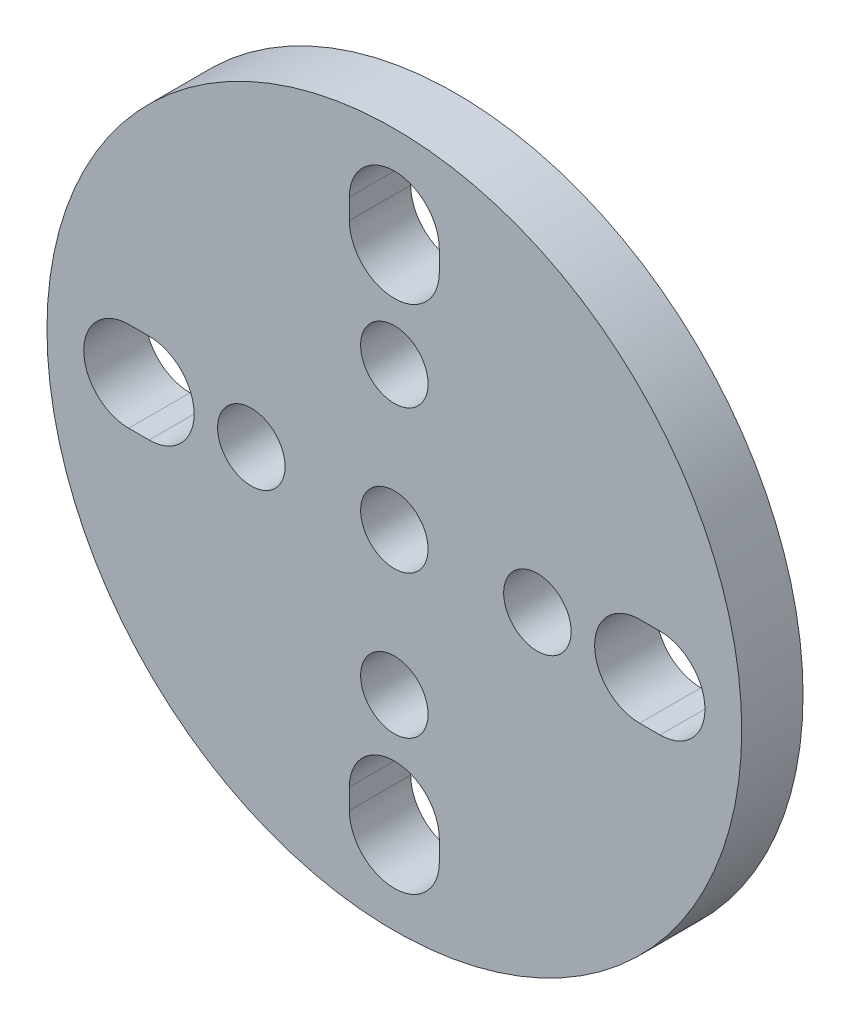
ISO-10303-21;
HEADER;
FILE_DESCRIPTION(('STEP AP214'),'2;1');
FILE_NAME('part.step','',(''),(''),'','','');
FILE_SCHEMA(('AUTOMOTIVE_DESIGN { 1 0 10303 214 1 1 1 1 }'));
ENDSEC;
DATA;
#1=APPLICATION_CONTEXT('core data for automotive mechanical design processes');
#2=APPLICATION_PROTOCOL_DEFINITION('international standard','automotive_design',2000,#1);
#3=PRODUCT_CONTEXT('',#1,'mechanical');
#4=PRODUCT('Part','Part','',(#3));
#5=PRODUCT_RELATED_PRODUCT_CATEGORY('part','',(#4));
#6=PRODUCT_DEFINITION_FORMATION('','',#4);
#7=PRODUCT_DEFINITION_CONTEXT('part definition',#1,'design');
#8=PRODUCT_DEFINITION('design','',#6,#7);
#9=PRODUCT_DEFINITION_SHAPE('','',#8);
#10=(LENGTH_UNIT() NAMED_UNIT(*) SI_UNIT(.MILLI.,.METRE.));
#11=(NAMED_UNIT(*) PLANE_ANGLE_UNIT() SI_UNIT($,.RADIAN.));
#12=(NAMED_UNIT(*) SI_UNIT($,.STERADIAN.) SOLID_ANGLE_UNIT());
#13=UNCERTAINTY_MEASURE_WITH_UNIT(LENGTH_MEASURE(1.E-05),#10,'distance_accuracy_value','');
#14=(GEOMETRIC_REPRESENTATION_CONTEXT(3) GLOBAL_UNCERTAINTY_ASSIGNED_CONTEXT((#13)) GLOBAL_UNIT_ASSIGNED_CONTEXT((#10,
#11,#12)) REPRESENTATION_CONTEXT('',''));
#15=CARTESIAN_POINT('',(0.,0.,0.));
#16=DIRECTION('',(0.,0.,1.));
#17=DIRECTION('',(1.,0.,0.));
#18=AXIS2_PLACEMENT_3D('',#15,#16,#17);
#19=CARTESIAN_POINT('',(0.,12.,3.));
#20=DIRECTION('',(0.,0.,-1.));
#21=DIRECTION('',(-1.,0.,0.));
#22=AXIS2_PLACEMENT_3D('',#19,#20,#21);
#23=CYLINDRICAL_SURFACE('',#22,2.2);
#24=CARTESIAN_POINT('',(0.,12.,0.));
#25=DIRECTION('',(0.,0.,1.));
#26=DIRECTION('',(1.,0.,0.));
#27=AXIS2_PLACEMENT_3D('',#24,#25,#26);
#28=CIRCLE('',#27,2.2);
#29=CARTESIAN_POINT('',(-2.2,12.,0.));
#30=VERTEX_POINT('',#29);
#31=CARTESIAN_POINT('',(2.2,12.,0.));
#32=VERTEX_POINT('',#31);
#33=EDGE_CURVE('E234',#30,#32,#28,.T.);
#34=ORIENTED_EDGE('',*,*,#33,.F.);
#35=DIRECTION('',(0.,0.,-1.));
#36=VECTOR('',#35,1.);
#37=CARTESIAN_POINT('',(-2.2,12.,3.));
#38=LINE('',#37,#36);
#39=CARTESIAN_POINT('',(-2.2,12.,3.));
#40=VERTEX_POINT('',#39);
#41=EDGE_CURVE('E11',#40,#30,#38,.T.);
#42=ORIENTED_EDGE('',*,*,#41,.F.);
#43=CARTESIAN_POINT('',(0.,12.,3.));
#44=DIRECTION('',(0.,0.,1.));
#45=DIRECTION('',(1.,0.,0.));
#46=AXIS2_PLACEMENT_3D('',#43,#44,#45);
#47=CIRCLE('',#46,2.2);
#48=CARTESIAN_POINT('',(2.2,12.,3.));
#49=VERTEX_POINT('',#48);
#50=EDGE_CURVE('E172',#40,#49,#47,.T.);
#51=ORIENTED_EDGE('',*,*,#50,.T.);
#52=DIRECTION('',(0.,0.,-1.));
#53=VECTOR('',#52,1.);
#54=CARTESIAN_POINT('',(2.2,12.,3.));
#55=LINE('',#54,#53);
#56=EDGE_CURVE('E112',#49,#32,#55,.T.);
#57=ORIENTED_EDGE('',*,*,#56,.T.);
#58=EDGE_LOOP('',(#34,#42,#51,#57));
#59=FACE_BOUND('',#58,.T.);
#60=ADVANCED_FACE('F35',(#59),#23,.F.);
#61=CARTESIAN_POINT('',(-2.2,0.,3.));
#62=DIRECTION('',(1.,0.,0.));
#63=DIRECTION('',(0.,0.,-1.));
#64=AXIS2_PLACEMENT_3D('',#61,#62,#63);
#65=PLANE('',#64);
#66=DIRECTION('',(0.,-1.,0.));
#67=VECTOR('',#66,1.);
#68=CARTESIAN_POINT('',(-2.2,0.,0.));
#69=LINE('',#68,#67);
#70=CARTESIAN_POINT('',(-2.2,13.,0.));
#71=VERTEX_POINT('',#70);
#72=EDGE_CURVE('E163',#71,#30,#69,.T.);
#73=ORIENTED_EDGE('',*,*,#72,.F.);
#74=DIRECTION('',(0.,0.,-1.));
#75=VECTOR('',#74,1.);
#76=CARTESIAN_POINT('',(-2.2,13.,3.));
#77=LINE('',#76,#75);
#78=CARTESIAN_POINT('',(-2.2,13.,3.));
#79=VERTEX_POINT('',#78);
#80=EDGE_CURVE('E45',#79,#71,#77,.T.);
#81=ORIENTED_EDGE('',*,*,#80,.F.);
#82=DIRECTION('',(0.,-1.,0.));
#83=VECTOR('',#82,1.);
#84=CARTESIAN_POINT('',(-2.2,0.,3.));
#85=LINE('',#84,#83);
#86=EDGE_CURVE('E161',#79,#40,#85,.T.);
#87=ORIENTED_EDGE('',*,*,#86,.T.);
#88=ORIENTED_EDGE('',*,*,#41,.T.);
#89=EDGE_LOOP('',(#73,#81,#87,#88));
#90=FACE_BOUND('',#89,.T.);
#91=ADVANCED_FACE('F160',(#90),#65,.T.);
#92=CARTESIAN_POINT('',(0.,13.,3.));
#93=DIRECTION('',(0.,0.,-1.));
#94=DIRECTION('',(-1.,0.,0.));
#95=AXIS2_PLACEMENT_3D('',#92,#93,#94);
#96=CYLINDRICAL_SURFACE('',#95,2.2);
#97=CARTESIAN_POINT('',(0.,13.,0.));
#98=DIRECTION('',(0.,0.,1.));
#99=DIRECTION('',(1.,0.,0.));
#100=AXIS2_PLACEMENT_3D('',#97,#98,#99);
#101=CIRCLE('',#100,2.2);
#102=CARTESIAN_POINT('',(2.2,13.,0.));
#103=VERTEX_POINT('',#102);
#104=EDGE_CURVE('E238',#103,#71,#101,.T.);
#105=ORIENTED_EDGE('',*,*,#104,.F.);
#106=DIRECTION('',(0.,0.,-1.));
#107=VECTOR('',#106,1.);
#108=CARTESIAN_POINT('',(2.2,13.,3.));
#109=LINE('',#108,#107);
#110=CARTESIAN_POINT('',(2.2,13.,3.));
#111=VERTEX_POINT('',#110);
#112=EDGE_CURVE('E105',#111,#103,#109,.T.);
#113=ORIENTED_EDGE('',*,*,#112,.F.);
#114=CARTESIAN_POINT('',(0.,13.,3.));
#115=DIRECTION('',(0.,0.,1.));
#116=DIRECTION('',(1.,0.,0.));
#117=AXIS2_PLACEMENT_3D('',#114,#115,#116);
#118=CIRCLE('',#117,2.2);
#119=EDGE_CURVE('E171',#111,#79,#118,.T.);
#120=ORIENTED_EDGE('',*,*,#119,.T.);
#121=ORIENTED_EDGE('',*,*,#80,.T.);
#122=EDGE_LOOP('',(#105,#113,#120,#121));
#123=FACE_BOUND('',#122,.T.);
#124=ADVANCED_FACE('F174',(#123),#96,.F.);
#125=CARTESIAN_POINT('',(12.,0.,3.));
#126=DIRECTION('',(0.,0.,-1.));
#127=DIRECTION('',(-1.,0.,0.));
#128=AXIS2_PLACEMENT_3D('',#125,#126,#127);
#129=CYLINDRICAL_SURFACE('',#128,2.2);
#130=CARTESIAN_POINT('',(12.,0.,0.));
#131=DIRECTION('',(0.,0.,1.));
#132=DIRECTION('',(1.,0.,0.));
#133=AXIS2_PLACEMENT_3D('',#130,#131,#132);
#134=CIRCLE('',#133,2.2);
#135=CARTESIAN_POINT('',(12.,2.2,0.));
#136=VERTEX_POINT('',#135);
#137=CARTESIAN_POINT('',(12.,-2.2,0.));
#138=VERTEX_POINT('',#137);
#139=EDGE_CURVE('E222',#136,#138,#134,.T.);
#140=ORIENTED_EDGE('',*,*,#139,.F.);
#141=DIRECTION('',(0.,0.,-1.));
#142=VECTOR('',#141,1.);
#143=CARTESIAN_POINT('',(12.,2.2,3.));
#144=LINE('',#143,#142);
#145=CARTESIAN_POINT('',(12.,2.2,3.));
#146=VERTEX_POINT('',#145);
#147=EDGE_CURVE('E262',#146,#136,#144,.T.);
#148=ORIENTED_EDGE('',*,*,#147,.F.);
#149=CARTESIAN_POINT('',(12.,0.,3.));
#150=DIRECTION('',(0.,0.,1.));
#151=DIRECTION('',(1.,0.,0.));
#152=AXIS2_PLACEMENT_3D('',#149,#150,#151);
#153=CIRCLE('',#152,2.2);
#154=CARTESIAN_POINT('',(12.,-2.2,3.));
#155=VERTEX_POINT('',#154);
#156=EDGE_CURVE('E321',#146,#155,#153,.T.);
#157=ORIENTED_EDGE('',*,*,#156,.T.);
#158=DIRECTION('',(0.,0.,-1.));
#159=VECTOR('',#158,1.);
#160=CARTESIAN_POINT('',(12.,-2.2,3.));
#161=LINE('',#160,#159);
#162=EDGE_CURVE('E264',#155,#138,#161,.T.);
#163=ORIENTED_EDGE('',*,*,#162,.T.);
#164=EDGE_LOOP('',(#140,#148,#157,#163));
#165=FACE_BOUND('',#164,.T.);
#166=ADVANCED_FACE('F364',(#165),#129,.F.);
#167=CARTESIAN_POINT('',(0.,2.2,3.));
#168=DIRECTION('',(0.,1.,0.));
#169=DIRECTION('',(0.,0.,1.));
#170=AXIS2_PLACEMENT_3D('',#167,#168,#169);
#171=PLANE('',#170);
#172=DIRECTION('',(1.,0.,0.));
#173=VECTOR('',#172,1.);
#174=CARTESIAN_POINT('',(0.,2.2,0.));
#175=LINE('',#174,#173);
#176=CARTESIAN_POINT('',(13.,2.2,0.));
#177=VERTEX_POINT('',#176);
#178=EDGE_CURVE('E225',#136,#177,#175,.T.);
#179=ORIENTED_EDGE('',*,*,#178,.T.);
#180=DIRECTION('',(0.,0.,-1.));
#181=VECTOR('',#180,1.);
#182=CARTESIAN_POINT('',(13.,2.2,3.));
#183=LINE('',#182,#181);
#184=CARTESIAN_POINT('',(13.,2.2,3.));
#185=VERTEX_POINT('',#184);
#186=EDGE_CURVE('E269',#185,#177,#183,.T.);
#187=ORIENTED_EDGE('',*,*,#186,.F.);
#188=DIRECTION('',(1.,0.,0.));
#189=VECTOR('',#188,1.);
#190=CARTESIAN_POINT('',(0.,2.2,3.));
#191=LINE('',#190,#189);
#192=EDGE_CURVE('E324',#146,#185,#191,.T.);
#193=ORIENTED_EDGE('',*,*,#192,.F.);
#194=ORIENTED_EDGE('',*,*,#147,.T.);
#195=EDGE_LOOP('',(#179,#187,#193,#194));
#196=FACE_BOUND('',#195,.T.);
#197=ADVANCED_FACE('F360',(#196),#171,.F.);
#198=CARTESIAN_POINT('',(13.,0.,3.));
#199=DIRECTION('',(0.,0.,-1.));
#200=DIRECTION('',(-1.,0.,0.));
#201=AXIS2_PLACEMENT_3D('',#198,#199,#200);
#202=CYLINDRICAL_SURFACE('',#201,2.2);
#203=CARTESIAN_POINT('',(13.,0.,0.));
#204=DIRECTION('',(0.,0.,1.));
#205=DIRECTION('',(1.,0.,0.));
#206=AXIS2_PLACEMENT_3D('',#203,#204,#205);
#207=CIRCLE('',#206,2.2);
#208=CARTESIAN_POINT('',(13.,-2.2,0.));
#209=VERTEX_POINT('',#208);
#210=EDGE_CURVE('E228',#209,#177,#207,.T.);
#211=ORIENTED_EDGE('',*,*,#210,.F.);
#212=DIRECTION('',(0.,0.,-1.));
#213=VECTOR('',#212,1.);
#214=CARTESIAN_POINT('',(13.,-2.2,3.));
#215=LINE('',#214,#213);
#216=CARTESIAN_POINT('',(13.,-2.2,3.));
#217=VERTEX_POINT('',#216);
#218=EDGE_CURVE('E266',#217,#209,#215,.T.);
#219=ORIENTED_EDGE('',*,*,#218,.F.);
#220=CARTESIAN_POINT('',(13.,0.,3.));
#221=DIRECTION('',(0.,0.,1.));
#222=DIRECTION('',(1.,0.,0.));
#223=AXIS2_PLACEMENT_3D('',#220,#221,#222);
#224=CIRCLE('',#223,2.2);
#225=EDGE_CURVE('E326',#217,#185,#224,.T.);
#226=ORIENTED_EDGE('',*,*,#225,.T.);
#227=ORIENTED_EDGE('',*,*,#186,.T.);
#228=EDGE_LOOP('',(#211,#219,#226,#227));
#229=FACE_BOUND('',#228,.T.);
#230=ADVANCED_FACE('F356',(#229),#202,.F.);
#231=CARTESIAN_POINT('',(0.,-12.,3.));
#232=DIRECTION('',(0.,0.,-1.));
#233=DIRECTION('',(-1.,0.,0.));
#234=AXIS2_PLACEMENT_3D('',#231,#232,#233);
#235=CYLINDRICAL_SURFACE('',#234,2.2);
#236=CARTESIAN_POINT('',(0.,-12.,0.));
#237=DIRECTION('',(0.,0.,1.));
#238=DIRECTION('',(1.,0.,0.));
#239=AXIS2_PLACEMENT_3D('',#236,#237,#238);
#240=CIRCLE('',#239,2.2);
#241=CARTESIAN_POINT('',(2.2,-12.,0.));
#242=VERTEX_POINT('',#241);
#243=CARTESIAN_POINT('',(-2.2,-12.,0.));
#244=VERTEX_POINT('',#243);
#245=EDGE_CURVE('E210',#242,#244,#240,.T.);
#246=ORIENTED_EDGE('',*,*,#245,.F.);
#247=DIRECTION('',(0.,0.,-1.));
#248=VECTOR('',#247,1.);
#249=CARTESIAN_POINT('',(2.2,-12.,3.));
#250=LINE('',#249,#248);
#251=CARTESIAN_POINT('',(2.2,-12.,3.));
#252=VERTEX_POINT('',#251);
#253=EDGE_CURVE('E267',#252,#242,#250,.T.);
#254=ORIENTED_EDGE('',*,*,#253,.F.);
#255=CARTESIAN_POINT('',(0.,-12.,3.));
#256=DIRECTION('',(0.,0.,1.));
#257=DIRECTION('',(1.,0.,0.));
#258=AXIS2_PLACEMENT_3D('',#255,#256,#257);
#259=CIRCLE('',#258,2.2);
#260=CARTESIAN_POINT('',(-2.2,-12.,3.));
#261=VERTEX_POINT('',#260);
#262=EDGE_CURVE('E304',#252,#261,#259,.T.);
#263=ORIENTED_EDGE('',*,*,#262,.T.);
#264=DIRECTION('',(0.,0.,-1.));
#265=VECTOR('',#264,1.);
#266=CARTESIAN_POINT('',(-2.2,-12.,3.));
#267=LINE('',#266,#265);
#268=EDGE_CURVE('E272',#261,#244,#267,.T.);
#269=ORIENTED_EDGE('',*,*,#268,.T.);
#270=EDGE_LOOP('',(#246,#254,#263,#269));
#271=FACE_BOUND('',#270,.T.);
#272=ADVANCED_FACE('F359',(#271),#235,.F.);
#273=CARTESIAN_POINT('',(2.2,0.,3.));
#274=DIRECTION('',(-1.,0.,0.));
#275=DIRECTION('',(0.,0.,1.));
#276=AXIS2_PLACEMENT_3D('',#273,#274,#275);
#277=PLANE('',#276);
#278=DIRECTION('',(0.,1.,0.));
#279=VECTOR('',#278,1.);
#280=CARTESIAN_POINT('',(2.2,0.,0.));
#281=LINE('',#280,#279);
#282=CARTESIAN_POINT('',(2.2,-13.,0.));
#283=VERTEX_POINT('',#282);
#284=EDGE_CURVE('E213',#283,#242,#281,.T.);
#285=ORIENTED_EDGE('',*,*,#284,.F.);
#286=DIRECTION('',(0.,0.,-1.));
#287=VECTOR('',#286,1.);
#288=CARTESIAN_POINT('',(2.2,-13.,3.));
#289=LINE('',#288,#287);
#290=CARTESIAN_POINT('',(2.2,-13.,3.));
#291=VERTEX_POINT('',#290);
#292=EDGE_CURVE('E276',#291,#283,#289,.T.);
#293=ORIENTED_EDGE('',*,*,#292,.F.);
#294=DIRECTION('',(0.,1.,0.));
#295=VECTOR('',#294,1.);
#296=CARTESIAN_POINT('',(2.2,0.,3.));
#297=LINE('',#296,#295);
#298=EDGE_CURVE('E313',#291,#252,#297,.T.);
#299=ORIENTED_EDGE('',*,*,#298,.T.);
#300=ORIENTED_EDGE('',*,*,#253,.T.);
#301=EDGE_LOOP('',(#285,#293,#299,#300));
#302=FACE_BOUND('',#301,.T.);
#303=ADVANCED_FACE('F375',(#302),#277,.T.);
#304=CARTESIAN_POINT('',(0.,-13.,3.));
#305=DIRECTION('',(0.,0.,-1.));
#306=DIRECTION('',(-1.,0.,0.));
#307=AXIS2_PLACEMENT_3D('',#304,#305,#306);
#308=CYLINDRICAL_SURFACE('',#307,2.2);
#309=CARTESIAN_POINT('',(0.,-13.,0.));
#310=DIRECTION('',(0.,0.,1.));
#311=DIRECTION('',(1.,0.,0.));
#312=AXIS2_PLACEMENT_3D('',#309,#310,#311);
#313=CIRCLE('',#312,2.2);
#314=CARTESIAN_POINT('',(-2.2,-13.,0.));
#315=VERTEX_POINT('',#314);
#316=EDGE_CURVE('E216',#315,#283,#313,.T.);
#317=ORIENTED_EDGE('',*,*,#316,.F.);
#318=DIRECTION('',(0.,0.,-1.));
#319=VECTOR('',#318,1.);
#320=CARTESIAN_POINT('',(-2.2,-13.,3.));
#321=LINE('',#320,#319);
#322=CARTESIAN_POINT('',(-2.2,-13.,3.));
#323=VERTEX_POINT('',#322);
#324=EDGE_CURVE('E274',#323,#315,#321,.T.);
#325=ORIENTED_EDGE('',*,*,#324,.F.);
#326=CARTESIAN_POINT('',(0.,-13.,3.));
#327=DIRECTION('',(0.,0.,1.));
#328=DIRECTION('',(1.,0.,0.));
#329=AXIS2_PLACEMENT_3D('',#326,#327,#328);
#330=CIRCLE('',#329,2.2);
#331=EDGE_CURVE('E316',#323,#291,#330,.T.);
#332=ORIENTED_EDGE('',*,*,#331,.T.);
#333=ORIENTED_EDGE('',*,*,#292,.T.);
#334=EDGE_LOOP('',(#317,#325,#332,#333));
#335=FACE_BOUND('',#334,.T.);
#336=ADVANCED_FACE('F372',(#335),#308,.F.);
#337=CARTESIAN_POINT('',(-12.,0.,3.));
#338=DIRECTION('',(0.,0.,-1.));
#339=DIRECTION('',(-1.,0.,0.));
#340=AXIS2_PLACEMENT_3D('',#337,#338,#339);
#341=CYLINDRICAL_SURFACE('',#340,2.2);
#342=CARTESIAN_POINT('',(-12.,0.,0.));
#343=DIRECTION('',(0.,0.,1.));
#344=DIRECTION('',(1.,0.,0.));
#345=AXIS2_PLACEMENT_3D('',#342,#343,#344);
#346=CIRCLE('',#345,2.2);
#347=CARTESIAN_POINT('',(-12.,-2.2,0.));
#348=VERTEX_POINT('',#347);
#349=CARTESIAN_POINT('',(-12.,2.2,0.));
#350=VERTEX_POINT('',#349);
#351=EDGE_CURVE('E198',#348,#350,#346,.T.);
#352=ORIENTED_EDGE('',*,*,#351,.F.);
#353=DIRECTION('',(0.,0.,-1.));
#354=VECTOR('',#353,1.);
#355=CARTESIAN_POINT('',(-12.,-2.2,3.));
#356=LINE('',#355,#354);
#357=CARTESIAN_POINT('',(-12.,-2.2,3.));
#358=VERTEX_POINT('',#357);
#359=EDGE_CURVE('E39',#358,#348,#356,.T.);
#360=ORIENTED_EDGE('',*,*,#359,.F.);
#361=CARTESIAN_POINT('',(-12.,0.,3.));
#362=DIRECTION('',(0.,0.,1.));
#363=DIRECTION('',(1.,0.,0.));
#364=AXIS2_PLACEMENT_3D('',#361,#362,#363);
#365=CIRCLE('',#364,2.2);
#366=CARTESIAN_POINT('',(-12.,2.2,3.));
#367=VERTEX_POINT('',#366);
#368=EDGE_CURVE('E260',#358,#367,#365,.T.);
#369=ORIENTED_EDGE('',*,*,#368,.T.);
#370=DIRECTION('',(0.,0.,-1.));
#371=VECTOR('',#370,1.);
#372=CARTESIAN_POINT('',(-12.,2.2,3.));
#373=LINE('',#372,#371);
#374=EDGE_CURVE('E197',#367,#350,#373,.T.);
#375=ORIENTED_EDGE('',*,*,#374,.T.);
#376=EDGE_LOOP('',(#352,#360,#369,#375));
#377=FACE_BOUND('',#376,.T.);
#378=ADVANCED_FACE('F37',(#377),#341,.F.);
#379=CARTESIAN_POINT('',(0.,-2.2,3.));
#380=DIRECTION('',(0.,-1.,0.));
#381=DIRECTION('',(0.,0.,-1.));
#382=AXIS2_PLACEMENT_3D('',#379,#380,#381);
#383=PLANE('',#382);
#384=DIRECTION('',(-1.,0.,0.));
#385=VECTOR('',#384,1.);
#386=CARTESIAN_POINT('',(0.,-2.2,0.));
#387=LINE('',#386,#385);
#388=CARTESIAN_POINT('',(-13.,-2.2,0.));
#389=VERTEX_POINT('',#388);
#390=EDGE_CURVE('E201',#348,#389,#387,.T.);
#391=ORIENTED_EDGE('',*,*,#390,.T.);
#392=DIRECTION('',(0.,0.,-1.));
#393=VECTOR('',#392,1.);
#394=CARTESIAN_POINT('',(-13.,-2.2,3.));
#395=LINE('',#394,#393);
#396=CARTESIAN_POINT('',(-13.,-2.2,3.));
#397=VERTEX_POINT('',#396);
#398=EDGE_CURVE('E281',#397,#389,#395,.T.);
#399=ORIENTED_EDGE('',*,*,#398,.F.);
#400=DIRECTION('',(-1.,0.,0.));
#401=VECTOR('',#400,1.);
#402=CARTESIAN_POINT('',(0.,-2.2,3.));
#403=LINE('',#402,#401);
#404=EDGE_CURVE('E289',#358,#397,#403,.T.);
#405=ORIENTED_EDGE('',*,*,#404,.F.);
#406=ORIENTED_EDGE('',*,*,#359,.T.);
#407=EDGE_LOOP('',(#391,#399,#405,#406));
#408=FACE_BOUND('',#407,.T.);
#409=ADVANCED_FACE('F288',(#408),#383,.F.);
#410=CARTESIAN_POINT('',(-13.,0.,3.));
#411=DIRECTION('',(0.,0.,-1.));
#412=DIRECTION('',(-1.,0.,0.));
#413=AXIS2_PLACEMENT_3D('',#410,#411,#412);
#414=CYLINDRICAL_SURFACE('',#413,2.2);
#415=CARTESIAN_POINT('',(-13.,0.,0.));
#416=DIRECTION('',(0.,0.,1.));
#417=DIRECTION('',(1.,0.,0.));
#418=AXIS2_PLACEMENT_3D('',#415,#416,#417);
#419=CIRCLE('',#418,2.2);
#420=CARTESIAN_POINT('',(-13.,2.2,0.));
#421=VERTEX_POINT('',#420);
#422=EDGE_CURVE('E204',#421,#389,#419,.T.);
#423=ORIENTED_EDGE('',*,*,#422,.F.);
#424=DIRECTION('',(0.,0.,-1.));
#425=VECTOR('',#424,1.);
#426=CARTESIAN_POINT('',(-13.,2.2,3.));
#427=LINE('',#426,#425);
#428=CARTESIAN_POINT('',(-13.,2.2,3.));
#429=VERTEX_POINT('',#428);
#430=EDGE_CURVE('E280',#429,#421,#427,.T.);
#431=ORIENTED_EDGE('',*,*,#430,.F.);
#432=CARTESIAN_POINT('',(-13.,0.,3.));
#433=DIRECTION('',(0.,0.,1.));
#434=DIRECTION('',(1.,0.,0.));
#435=AXIS2_PLACEMENT_3D('',#432,#433,#434);
#436=CIRCLE('',#435,2.2);
#437=EDGE_CURVE('E301',#429,#397,#436,.T.);
#438=ORIENTED_EDGE('',*,*,#437,.T.);
#439=ORIENTED_EDGE('',*,*,#398,.T.);
#440=EDGE_LOOP('',(#423,#431,#438,#439));
#441=FACE_BOUND('',#440,.T.);
#442=ADVANCED_FACE('F299',(#441),#414,.F.);
#443=CARTESIAN_POINT('',(0.,0.,3.));
#444=DIRECTION('',(0.,0.,-1.));
#445=DIRECTION('',(-1.,0.,0.));
#446=AXIS2_PLACEMENT_3D('',#443,#444,#445);
#447=CYLINDRICAL_SURFACE('',#446,1.65);
#448=CARTESIAN_POINT('',(0.,0.,3.));
#449=DIRECTION('',(0.,0.,1.));
#450=DIRECTION('',(1.,0.,0.));
#451=AXIS2_PLACEMENT_3D('',#448,#449,#450);
#452=CIRCLE('',#451,1.65);
#453=CARTESIAN_POINT('',(1.65,0.,3.));
#454=VERTEX_POINT('',#453);
#455=EDGE_CURVE('E191',#454,#454,#452,.T.);
#456=ORIENTED_EDGE('',*,*,#455,.T.);
#457=EDGE_LOOP('',(#456));
#458=FACE_BOUND('',#457,.T.);
#459=CARTESIAN_POINT('',(0.,0.,0.));
#460=DIRECTION('',(0.,0.,1.));
#461=DIRECTION('',(1.,0.,0.));
#462=AXIS2_PLACEMENT_3D('',#459,#460,#461);
#463=CIRCLE('',#462,1.65);
#464=CARTESIAN_POINT('',(1.65,0.,0.));
#465=VERTEX_POINT('',#464);
#466=EDGE_CURVE('E254',#465,#465,#463,.T.);
#467=ORIENTED_EDGE('',*,*,#466,.F.);
#468=EDGE_LOOP('',(#467));
#469=FACE_BOUND('',#468,.T.);
#470=ADVANCED_FACE('F387',(#458,#469),#447,.F.);
#471=CARTESIAN_POINT('',(0.,7.,3.));
#472=DIRECTION('',(0.,0.,-1.));
#473=DIRECTION('',(-1.,0.,0.));
#474=AXIS2_PLACEMENT_3D('',#471,#472,#473);
#475=CYLINDRICAL_SURFACE('',#474,1.65);
#476=CARTESIAN_POINT('',(0.,7.,3.));
#477=DIRECTION('',(0.,0.,1.));
#478=DIRECTION('',(1.,0.,0.));
#479=AXIS2_PLACEMENT_3D('',#476,#477,#478);
#480=CIRCLE('',#479,1.65);
#481=CARTESIAN_POINT('',(1.65,7.,3.));
#482=VERTEX_POINT('',#481);
#483=EDGE_CURVE('E188',#482,#482,#480,.T.);
#484=ORIENTED_EDGE('',*,*,#483,.T.);
#485=EDGE_LOOP('',(#484));
#486=FACE_BOUND('',#485,.T.);
#487=CARTESIAN_POINT('',(0.,7.,0.));
#488=DIRECTION('',(0.,0.,1.));
#489=DIRECTION('',(1.,0.,0.));
#490=AXIS2_PLACEMENT_3D('',#487,#488,#489);
#491=CIRCLE('',#490,1.65);
#492=CARTESIAN_POINT('',(1.65,7.,0.));
#493=VERTEX_POINT('',#492);
#494=EDGE_CURVE('E251',#493,#493,#491,.T.);
#495=ORIENTED_EDGE('',*,*,#494,.F.);
#496=EDGE_LOOP('',(#495));
#497=FACE_BOUND('',#496,.T.);
#498=ADVANCED_FACE('F466',(#486,#497),#475,.F.);
#499=CARTESIAN_POINT('',(7.,0.,3.));
#500=DIRECTION('',(0.,0.,-1.));
#501=DIRECTION('',(-1.,0.,0.));
#502=AXIS2_PLACEMENT_3D('',#499,#500,#501);
#503=CYLINDRICAL_SURFACE('',#502,1.65);
#504=CARTESIAN_POINT('',(7.,0.,3.));
#505=DIRECTION('',(0.,0.,1.));
#506=DIRECTION('',(1.,0.,0.));
#507=AXIS2_PLACEMENT_3D('',#504,#505,#506);
#508=CIRCLE('',#507,1.65);
#509=CARTESIAN_POINT('',(8.65,0.,3.));
#510=VERTEX_POINT('',#509);
#511=EDGE_CURVE('E185',#510,#510,#508,.T.);
#512=ORIENTED_EDGE('',*,*,#511,.T.);
#513=EDGE_LOOP('',(#512));
#514=FACE_BOUND('',#513,.T.);
#515=CARTESIAN_POINT('',(7.,0.,0.));
#516=DIRECTION('',(0.,0.,1.));
#517=DIRECTION('',(1.,0.,0.));
#518=AXIS2_PLACEMENT_3D('',#515,#516,#517);
#519=CIRCLE('',#518,1.65);
#520=CARTESIAN_POINT('',(8.65,0.,0.));
#521=VERTEX_POINT('',#520);
#522=EDGE_CURVE('E248',#521,#521,#519,.T.);
#523=ORIENTED_EDGE('',*,*,#522,.F.);
#524=EDGE_LOOP('',(#523));
#525=FACE_BOUND('',#524,.T.);
#526=ADVANCED_FACE('F475',(#514,#525),#503,.F.);
#527=CARTESIAN_POINT('',(0.,-7.,3.));
#528=DIRECTION('',(0.,0.,-1.));
#529=DIRECTION('',(-1.,0.,0.));
#530=AXIS2_PLACEMENT_3D('',#527,#528,#529);
#531=CYLINDRICAL_SURFACE('',#530,1.65);
#532=CARTESIAN_POINT('',(0.,-7.,3.));
#533=DIRECTION('',(0.,0.,1.));
#534=DIRECTION('',(1.,0.,0.));
#535=AXIS2_PLACEMENT_3D('',#532,#533,#534);
#536=CIRCLE('',#535,1.65);
#537=CARTESIAN_POINT('',(1.65,-7.,3.));
#538=VERTEX_POINT('',#537);
#539=EDGE_CURVE('E182',#538,#538,#536,.T.);
#540=ORIENTED_EDGE('',*,*,#539,.T.);
#541=EDGE_LOOP('',(#540));
#542=FACE_BOUND('',#541,.T.);
#543=CARTESIAN_POINT('',(0.,-7.,0.));
#544=DIRECTION('',(0.,0.,1.));
#545=DIRECTION('',(1.,0.,0.));
#546=AXIS2_PLACEMENT_3D('',#543,#544,#545);
#547=CIRCLE('',#546,1.65);
#548=CARTESIAN_POINT('',(1.65,-7.,0.));
#549=VERTEX_POINT('',#548);
#550=EDGE_CURVE('E245',#549,#549,#547,.T.);
#551=ORIENTED_EDGE('',*,*,#550,.F.);
#552=EDGE_LOOP('',(#551));
#553=FACE_BOUND('',#552,.T.);
#554=ADVANCED_FACE('F345',(#542,#553),#531,.F.);
#555=CARTESIAN_POINT('',(-7.,0.,3.));
#556=DIRECTION('',(0.,0.,-1.));
#557=DIRECTION('',(-1.,0.,0.));
#558=AXIS2_PLACEMENT_3D('',#555,#556,#557);
#559=CYLINDRICAL_SURFACE('',#558,1.65);
#560=CARTESIAN_POINT('',(-7.,0.,3.));
#561=DIRECTION('',(0.,0.,1.));
#562=DIRECTION('',(1.,0.,0.));
#563=AXIS2_PLACEMENT_3D('',#560,#561,#562);
#564=CIRCLE('',#563,1.65);
#565=CARTESIAN_POINT('',(-5.35,0.,3.));
#566=VERTEX_POINT('',#565);
#567=EDGE_CURVE('E176',#566,#566,#564,.T.);
#568=ORIENTED_EDGE('',*,*,#567,.T.);
#569=EDGE_LOOP('',(#568));
#570=FACE_BOUND('',#569,.T.);
#571=CARTESIAN_POINT('',(-7.,0.,0.));
#572=DIRECTION('',(0.,0.,1.));
#573=DIRECTION('',(1.,0.,0.));
#574=AXIS2_PLACEMENT_3D('',#571,#572,#573);
#575=CIRCLE('',#574,1.65);
#576=CARTESIAN_POINT('',(-5.35,0.,0.));
#577=VERTEX_POINT('',#576);
#578=EDGE_CURVE('E242',#577,#577,#575,.T.);
#579=ORIENTED_EDGE('',*,*,#578,.F.);
#580=EDGE_LOOP('',(#579));
#581=FACE_BOUND('',#580,.T.);
#582=ADVANCED_FACE('F336',(#570,#581),#559,.F.);
#583=CARTESIAN_POINT('',(2.2,0.,3.));
#584=DIRECTION('',(1.,0.,0.));
#585=DIRECTION('',(0.,0.,-1.));
#586=AXIS2_PLACEMENT_3D('',#583,#584,#585);
#587=PLANE('',#586);
#588=DIRECTION('',(0.,-1.,0.));
#589=VECTOR('',#588,1.);
#590=CARTESIAN_POINT('',(2.2,0.,0.));
#591=LINE('',#590,#589);
#592=EDGE_CURVE('E240',#103,#32,#591,.T.);
#593=ORIENTED_EDGE('',*,*,#592,.T.);
#594=ORIENTED_EDGE('',*,*,#56,.F.);
#595=DIRECTION('',(0.,-1.,0.));
#596=VECTOR('',#595,1.);
#597=CARTESIAN_POINT('',(2.2,0.,3.));
#598=LINE('',#597,#596);
#599=EDGE_CURVE('E54',#111,#49,#598,.T.);
#600=ORIENTED_EDGE('',*,*,#599,.F.);
#601=ORIENTED_EDGE('',*,*,#112,.T.);
#602=EDGE_LOOP('',(#593,#594,#600,#601));
#603=FACE_BOUND('',#602,.T.);
#604=ADVANCED_FACE('F333',(#603),#587,.F.);
#605=CARTESIAN_POINT('',(0.,-2.2,3.));
#606=DIRECTION('',(0.,1.,0.));
#607=DIRECTION('',(0.,0.,1.));
#608=AXIS2_PLACEMENT_3D('',#605,#606,#607);
#609=PLANE('',#608);
#610=DIRECTION('',(1.,0.,0.));
#611=VECTOR('',#610,1.);
#612=CARTESIAN_POINT('',(0.,-2.2,0.));
#613=LINE('',#612,#611);
#614=EDGE_CURVE('E231',#138,#209,#613,.T.);
#615=ORIENTED_EDGE('',*,*,#614,.F.);
#616=ORIENTED_EDGE('',*,*,#162,.F.);
#617=DIRECTION('',(1.,0.,0.));
#618=VECTOR('',#617,1.);
#619=CARTESIAN_POINT('',(0.,-2.2,3.));
#620=LINE('',#619,#618);
#621=EDGE_CURVE('E329',#155,#217,#620,.T.);
#622=ORIENTED_EDGE('',*,*,#621,.T.);
#623=ORIENTED_EDGE('',*,*,#218,.T.);
#624=EDGE_LOOP('',(#615,#616,#622,#623));
#625=FACE_BOUND('',#624,.T.);
#626=ADVANCED_FACE('F335',(#625),#609,.T.);
#627=CARTESIAN_POINT('',(-2.2,0.,3.));
#628=DIRECTION('',(-1.,0.,0.));
#629=DIRECTION('',(0.,0.,1.));
#630=AXIS2_PLACEMENT_3D('',#627,#628,#629);
#631=PLANE('',#630);
#632=DIRECTION('',(0.,1.,0.));
#633=VECTOR('',#632,1.);
#634=CARTESIAN_POINT('',(-2.2,0.,0.));
#635=LINE('',#634,#633);
#636=EDGE_CURVE('E219',#315,#244,#635,.T.);
#637=ORIENTED_EDGE('',*,*,#636,.T.);
#638=ORIENTED_EDGE('',*,*,#268,.F.);
#639=DIRECTION('',(0.,1.,0.));
#640=VECTOR('',#639,1.);
#641=CARTESIAN_POINT('',(-2.2,0.,3.));
#642=LINE('',#641,#640);
#643=EDGE_CURVE('E319',#323,#261,#642,.T.);
#644=ORIENTED_EDGE('',*,*,#643,.F.);
#645=ORIENTED_EDGE('',*,*,#324,.T.);
#646=EDGE_LOOP('',(#637,#638,#644,#645));
#647=FACE_BOUND('',#646,.T.);
#648=ADVANCED_FACE('F342',(#647),#631,.F.);
#649=CARTESIAN_POINT('',(0.,2.2,3.));
#650=DIRECTION('',(0.,1.,0.));
#651=DIRECTION('',(0.,0.,1.));
#652=AXIS2_PLACEMENT_3D('',#649,#650,#651);
#653=PLANE('',#652);
#654=DIRECTION('',(1.,0.,0.));
#655=VECTOR('',#654,1.);
#656=CARTESIAN_POINT('',(0.,2.2,0.));
#657=LINE('',#656,#655);
#658=EDGE_CURVE('E207',#421,#350,#657,.T.);
#659=ORIENTED_EDGE('',*,*,#658,.T.);
#660=ORIENTED_EDGE('',*,*,#374,.F.);
#661=DIRECTION('',(1.,0.,0.));
#662=VECTOR('',#661,1.);
#663=CARTESIAN_POINT('',(0.,2.2,3.));
#664=LINE('',#663,#662);
#665=EDGE_CURVE('E302',#429,#367,#664,.T.);
#666=ORIENTED_EDGE('',*,*,#665,.F.);
#667=ORIENTED_EDGE('',*,*,#430,.T.);
#668=EDGE_LOOP('',(#659,#660,#666,#667));
#669=FACE_BOUND('',#668,.T.);
#670=ADVANCED_FACE('F298',(#669),#653,.F.);
#671=CARTESIAN_POINT('',(0.,0.,3.));
#672=DIRECTION('',(0.,0.,-1.));
#673=DIRECTION('',(-1.,0.,0.));
#674=AXIS2_PLACEMENT_3D('',#671,#672,#673);
#675=CYLINDRICAL_SURFACE('',#674,17.);
#676=CARTESIAN_POINT('',(0.,0.,3.));
#677=DIRECTION('',(0.,0.,1.));
#678=DIRECTION('',(1.,0.,0.));
#679=AXIS2_PLACEMENT_3D('',#676,#677,#678);
#680=CIRCLE('',#679,17.);
#681=CARTESIAN_POINT('',(17.,0.,3.));
#682=VERTEX_POINT('',#681);
#683=EDGE_CURVE('E194',#682,#682,#680,.T.);
#684=ORIENTED_EDGE('',*,*,#683,.F.);
#685=EDGE_LOOP('',(#684));
#686=FACE_BOUND('',#685,.T.);
#687=CARTESIAN_POINT('',(0.,0.,0.));
#688=DIRECTION('',(0.,0.,1.));
#689=DIRECTION('',(1.,0.,0.));
#690=AXIS2_PLACEMENT_3D('',#687,#688,#689);
#691=CIRCLE('',#690,17.);
#692=CARTESIAN_POINT('',(17.,0.,0.));
#693=VERTEX_POINT('',#692);
#694=EDGE_CURVE('E257',#693,#693,#691,.T.);
#695=ORIENTED_EDGE('',*,*,#694,.T.);
#696=EDGE_LOOP('',(#695));
#697=FACE_BOUND('',#696,.T.);
#698=ADVANCED_FACE('F385',(#686,#697),#675,.T.);
#699=CARTESIAN_POINT('',(0.,0.,3.));
#700=DIRECTION('',(0.,0.,1.));
#701=DIRECTION('',(1.,0.,0.));
#702=AXIS2_PLACEMENT_3D('',#699,#700,#701);
#703=PLANE('',#702);
#704=ORIENTED_EDGE('',*,*,#368,.F.);
#705=ORIENTED_EDGE('',*,*,#404,.T.);
#706=ORIENTED_EDGE('',*,*,#437,.F.);
#707=ORIENTED_EDGE('',*,*,#665,.T.);
#708=EDGE_LOOP('',(#704,#705,#706,#707));
#709=FACE_BOUND('',#708,.T.);
#710=ORIENTED_EDGE('',*,*,#262,.F.);
#711=ORIENTED_EDGE('',*,*,#298,.F.);
#712=ORIENTED_EDGE('',*,*,#331,.F.);
#713=ORIENTED_EDGE('',*,*,#643,.T.);
#714=EDGE_LOOP('',(#710,#711,#712,#713));
#715=FACE_BOUND('',#714,.T.);
#716=ORIENTED_EDGE('',*,*,#156,.F.);
#717=ORIENTED_EDGE('',*,*,#192,.T.);
#718=ORIENTED_EDGE('',*,*,#225,.F.);
#719=ORIENTED_EDGE('',*,*,#621,.F.);
#720=EDGE_LOOP('',(#716,#717,#718,#719));
#721=FACE_BOUND('',#720,.T.);
#722=ORIENTED_EDGE('',*,*,#50,.F.);
#723=ORIENTED_EDGE('',*,*,#86,.F.);
#724=ORIENTED_EDGE('',*,*,#119,.F.);
#725=ORIENTED_EDGE('',*,*,#599,.T.);
#726=EDGE_LOOP('',(#722,#723,#724,#725));
#727=FACE_BOUND('',#726,.T.);
#728=ORIENTED_EDGE('',*,*,#567,.F.);
#729=EDGE_LOOP('',(#728));
#730=FACE_BOUND('',#729,.T.);
#731=ORIENTED_EDGE('',*,*,#539,.F.);
#732=EDGE_LOOP('',(#731));
#733=FACE_BOUND('',#732,.T.);
#734=ORIENTED_EDGE('',*,*,#511,.F.);
#735=EDGE_LOOP('',(#734));
#736=FACE_BOUND('',#735,.T.);
#737=ORIENTED_EDGE('',*,*,#483,.F.);
#738=EDGE_LOOP('',(#737));
#739=FACE_BOUND('',#738,.T.);
#740=ORIENTED_EDGE('',*,*,#455,.F.);
#741=EDGE_LOOP('',(#740));
#742=FACE_BOUND('',#741,.T.);
#743=ORIENTED_EDGE('',*,*,#683,.T.);
#744=EDGE_LOOP('',(#743));
#745=FACE_BOUND('',#744,.T.);
#746=ADVANCED_FACE('F169',(#709,#715,#721,#727,#730,#733,#736,#739,#742,#745),#703,.T.);
#747=CARTESIAN_POINT('',(0.,0.,0.));
#748=DIRECTION('',(0.,0.,1.));
#749=DIRECTION('',(1.,0.,0.));
#750=AXIS2_PLACEMENT_3D('',#747,#748,#749);
#751=PLANE('',#750);
#752=ORIENTED_EDGE('',*,*,#351,.T.);
#753=ORIENTED_EDGE('',*,*,#658,.F.);
#754=ORIENTED_EDGE('',*,*,#422,.T.);
#755=ORIENTED_EDGE('',*,*,#390,.F.);
#756=EDGE_LOOP('',(#752,#753,#754,#755));
#757=FACE_BOUND('',#756,.T.);
#758=ORIENTED_EDGE('',*,*,#245,.T.);
#759=ORIENTED_EDGE('',*,*,#636,.F.);
#760=ORIENTED_EDGE('',*,*,#316,.T.);
#761=ORIENTED_EDGE('',*,*,#284,.T.);
#762=EDGE_LOOP('',(#758,#759,#760,#761));
#763=FACE_BOUND('',#762,.T.);
#764=ORIENTED_EDGE('',*,*,#139,.T.);
#765=ORIENTED_EDGE('',*,*,#614,.T.);
#766=ORIENTED_EDGE('',*,*,#210,.T.);
#767=ORIENTED_EDGE('',*,*,#178,.F.);
#768=EDGE_LOOP('',(#764,#765,#766,#767));
#769=FACE_BOUND('',#768,.T.);
#770=ORIENTED_EDGE('',*,*,#33,.T.);
#771=ORIENTED_EDGE('',*,*,#592,.F.);
#772=ORIENTED_EDGE('',*,*,#104,.T.);
#773=ORIENTED_EDGE('',*,*,#72,.T.);
#774=EDGE_LOOP('',(#770,#771,#772,#773));
#775=FACE_BOUND('',#774,.T.);
#776=ORIENTED_EDGE('',*,*,#578,.T.);
#777=EDGE_LOOP('',(#776));
#778=FACE_BOUND('',#777,.T.);
#779=ORIENTED_EDGE('',*,*,#550,.T.);
#780=EDGE_LOOP('',(#779));
#781=FACE_BOUND('',#780,.T.);
#782=ORIENTED_EDGE('',*,*,#522,.T.);
#783=EDGE_LOOP('',(#782));
#784=FACE_BOUND('',#783,.T.);
#785=ORIENTED_EDGE('',*,*,#494,.T.);
#786=EDGE_LOOP('',(#785));
#787=FACE_BOUND('',#786,.T.);
#788=ORIENTED_EDGE('',*,*,#466,.T.);
#789=EDGE_LOOP('',(#788));
#790=FACE_BOUND('',#789,.T.);
#791=ORIENTED_EDGE('',*,*,#694,.F.);
#792=EDGE_LOOP('',(#791));
#793=FACE_BOUND('',#792,.T.);
#794=ADVANCED_FACE('F292',(#757,#763,#769,#775,#778,#781,#784,#787,#790,#793),#751,.F.);
#795=CLOSED_SHELL('',(#60,#91,#124,#166,#197,#230,#272,#303,#336,#378,#409,#442,#470,#498,#526,
#554,#582,#604,#626,#648,#670,#698,#746,#794));
#796=MANIFOLD_SOLID_BREP('B2',#795);
#797=ADVANCED_BREP_SHAPE_REPRESENTATION('',(#18,#796),#14);
#798=SHAPE_DEFINITION_REPRESENTATION(#9,#797);
ENDSEC;
END-ISO-10303-21;
